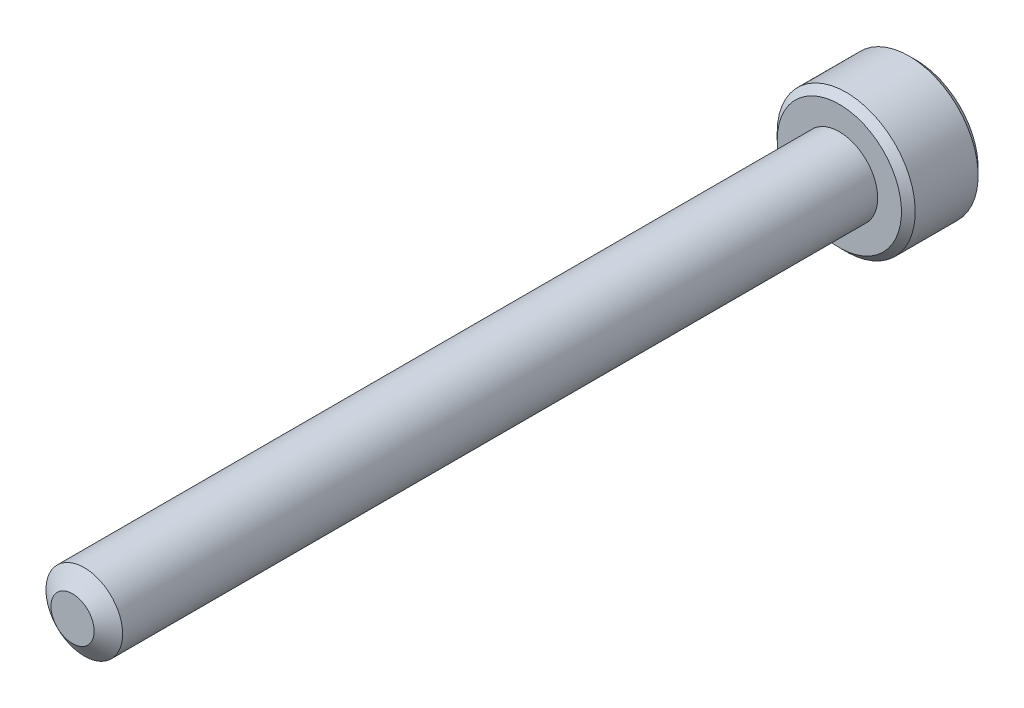
ISO-10303-21;
HEADER;
FILE_DESCRIPTION(('STEP AP214'),'2;1');
FILE_NAME('part.step','',(''),(''),'','','');
FILE_SCHEMA(('AUTOMOTIVE_DESIGN { 1 0 10303 214 1 1 1 1 }'));
ENDSEC;
DATA;
#1=APPLICATION_CONTEXT('core data for automotive mechanical design processes');
#2=APPLICATION_PROTOCOL_DEFINITION('international standard','automotive_design',2000,#1);
#3=PRODUCT_CONTEXT('',#1,'mechanical');
#4=PRODUCT('Part','Part','',(#3));
#5=PRODUCT_RELATED_PRODUCT_CATEGORY('part','',(#4));
#6=PRODUCT_DEFINITION_FORMATION('','',#4);
#7=PRODUCT_DEFINITION_CONTEXT('part definition',#1,'design');
#8=PRODUCT_DEFINITION('design','',#6,#7);
#9=PRODUCT_DEFINITION_SHAPE('','',#8);
#10=(LENGTH_UNIT() NAMED_UNIT(*) SI_UNIT(.MILLI.,.METRE.));
#11=(NAMED_UNIT(*) PLANE_ANGLE_UNIT() SI_UNIT($,.RADIAN.));
#12=(NAMED_UNIT(*) SI_UNIT($,.STERADIAN.) SOLID_ANGLE_UNIT());
#13=UNCERTAINTY_MEASURE_WITH_UNIT(LENGTH_MEASURE(1.E-05),#10,'distance_accuracy_value','');
#14=(GEOMETRIC_REPRESENTATION_CONTEXT(3) GLOBAL_UNCERTAINTY_ASSIGNED_CONTEXT((#13)) GLOBAL_UNIT_ASSIGNED_CONTEXT((#10,
#11,#12)) REPRESENTATION_CONTEXT('',''));
#15=CARTESIAN_POINT('',(0.,0.,0.));
#16=DIRECTION('',(0.,0.,1.));
#17=DIRECTION('',(1.,0.,0.));
#18=AXIS2_PLACEMENT_3D('',#15,#16,#17);
#19=CARTESIAN_POINT('',(0.,0.,-25.));
#20=DIRECTION('',(0.,0.,1.));
#21=DIRECTION('',(1.,0.,0.));
#22=AXIS2_PLACEMENT_3D('',#19,#20,#21);
#23=CYLINDRICAL_SURFACE('',#22,1.25);
#24=CARTESIAN_POINT('',(0.,0.,-25.));
#25=DIRECTION('',(0.,0.,-1.));
#26=DIRECTION('',(-1.,0.,0.));
#27=AXIS2_PLACEMENT_3D('',#24,#25,#26);
#28=CIRCLE('',#27,1.25);
#29=CARTESIAN_POINT('',(-1.25,0.,-25.));
#30=VERTEX_POINT('',#29);
#31=EDGE_CURVE('E213',#30,#30,#28,.F.);
#32=ORIENTED_EDGE('',*,*,#31,.T.);
#33=EDGE_LOOP('',(#32));
#34=FACE_BOUND('',#33,.T.);
#35=CARTESIAN_POINT('',(0.,0.,-0.382511876358969));
#36=DIRECTION('',(0.,0.,1.));
#37=DIRECTION('',(1.,0.,0.));
#38=AXIS2_PLACEMENT_3D('',#35,#36,#37);
#39=CIRCLE('',#38,1.25);
#40=CARTESIAN_POINT('',(1.25,0.,-0.382511876358969));
#41=VERTEX_POINT('',#40);
#42=EDGE_CURVE('E107',#41,#41,#39,.T.);
#43=ORIENTED_EDGE('',*,*,#42,.F.);
#44=EDGE_LOOP('',(#43));
#45=FACE_BOUND('',#44,.T.);
#46=ADVANCED_FACE('F33',(#34,#45),#23,.T.);
#47=CARTESIAN_POINT('',(0.,0.,0.));
#48=DIRECTION('',(0.,0.,-1.));
#49=DIRECTION('',(-1.,0.,0.));
#50=AXIS2_PLACEMENT_3D('',#47,#48,#49);
#51=CONICAL_SURFACE('',#50,0.703716426222746,0.959931088596886);
#52=ORIENTED_EDGE('',*,*,#42,.T.);
#53=EDGE_LOOP('',(#52));
#54=FACE_BOUND('',#53,.T.);
#55=CARTESIAN_POINT('',(0.,0.,0.));
#56=DIRECTION('',(0.,0.,1.));
#57=DIRECTION('',(1.,0.,0.));
#58=AXIS2_PLACEMENT_3D('',#55,#56,#57);
#59=CIRCLE('',#58,0.703716426222746);
#60=CARTESIAN_POINT('',(0.703716426222746,0.,0.));
#61=VERTEX_POINT('',#60);
#62=EDGE_CURVE('E211',#61,#61,#59,.T.);
#63=ORIENTED_EDGE('',*,*,#62,.F.);
#64=EDGE_LOOP('',(#63));
#65=FACE_BOUND('',#64,.T.);
#66=ADVANCED_FACE('F194',(#54,#65),#51,.T.);
#67=CARTESIAN_POINT('',(0.,0.,0.));
#68=DIRECTION('',(0.,0.,1.));
#69=DIRECTION('',(1.,0.,0.));
#70=AXIS2_PLACEMENT_3D('',#67,#68,#69);
#71=PLANE('',#70);
#72=ORIENTED_EDGE('',*,*,#62,.T.);
#73=EDGE_LOOP('',(#72));
#74=FACE_BOUND('',#73,.T.);
#75=ADVANCED_FACE('F191',(#74),#71,.T.);
#76=CARTESIAN_POINT('',(0.,0.,-27.5));
#77=DIRECTION('',(0.,0.,1.));
#78=DIRECTION('',(1.,0.,0.));
#79=AXIS2_PLACEMENT_3D('',#76,#77,#78);
#80=CYLINDRICAL_SURFACE('',#79,2.25);
#81=CARTESIAN_POINT('',(0.,0.,-27.275));
#82=DIRECTION('',(0.,0.,-1.));
#83=DIRECTION('',(-1.,0.,0.));
#84=AXIS2_PLACEMENT_3D('',#81,#82,#83);
#85=CIRCLE('',#84,2.25);
#86=CARTESIAN_POINT('',(-2.25,0.,-27.275));
#87=VERTEX_POINT('',#86);
#88=EDGE_CURVE('E41',#87,#87,#85,.F.);
#89=ORIENTED_EDGE('',*,*,#88,.T.);
#90=EDGE_LOOP('',(#89));
#91=FACE_BOUND('',#90,.T.);
#92=CARTESIAN_POINT('',(0.,0.,-25.225));
#93=DIRECTION('',(0.,0.,-1.));
#94=DIRECTION('',(-1.,0.,0.));
#95=AXIS2_PLACEMENT_3D('',#92,#93,#94);
#96=CIRCLE('',#95,2.25);
#97=CARTESIAN_POINT('',(-2.25,0.,-25.225));
#98=VERTEX_POINT('',#97);
#99=EDGE_CURVE('E170',#98,#98,#96,.T.);
#100=ORIENTED_EDGE('',*,*,#99,.T.);
#101=EDGE_LOOP('',(#100));
#102=FACE_BOUND('',#101,.T.);
#103=ADVANCED_FACE('F175',(#91,#102),#80,.T.);
#104=CARTESIAN_POINT('',(0.,0.,-27.5));
#105=DIRECTION('',(0.,0.,-1.));
#106=DIRECTION('',(-1.,0.,0.));
#107=AXIS2_PLACEMENT_3D('',#104,#105,#106);
#108=PLANE('',#107);
#109=CARTESIAN_POINT('',(0.,0.,-27.5));
#110=DIRECTION('',(0.,0.,-1.));
#111=DIRECTION('',(-1.,0.,0.));
#112=AXIS2_PLACEMENT_3D('',#109,#110,#111);
#113=CIRCLE('',#112,2.025);
#114=CARTESIAN_POINT('',(-2.025,0.,-27.5));
#115=VERTEX_POINT('',#114);
#116=EDGE_CURVE('E106',#115,#115,#113,.T.);
#117=ORIENTED_EDGE('',*,*,#116,.T.);
#118=EDGE_LOOP('',(#117));
#119=FACE_BOUND('',#118,.T.);
#120=CARTESIAN_POINT('',(0.,0.,-27.5));
#121=DIRECTION('',(0.,0.,-1.));
#122=DIRECTION('',(-1.,0.,0.));
#123=AXIS2_PLACEMENT_3D('',#120,#121,#122);
#124=CIRCLE('',#123,1.15470053837925);
#125=CARTESIAN_POINT('',(-0.999999999999994,0.577350269189638,-27.5));
#126=VERTEX_POINT('',#125);
#127=CARTESIAN_POINT('',(0.,1.15470053837925,-27.5));
#128=VERTEX_POINT('',#127);
#129=EDGE_CURVE('E87',#126,#128,#124,.T.);
#130=ORIENTED_EDGE('',*,*,#129,.F.);
#131=CARTESIAN_POINT('',(-0.999999999999994,-0.577350269189627,-27.5));
#132=VERTEX_POINT('',#131);
#133=EDGE_CURVE('E47',#132,#126,#124,.T.);
#134=ORIENTED_EDGE('',*,*,#133,.F.);
#135=CARTESIAN_POINT('',(0.,-1.15470053837925,-27.5));
#136=VERTEX_POINT('',#135);
#137=EDGE_CURVE('E272',#136,#132,#124,.T.);
#138=ORIENTED_EDGE('',*,*,#137,.F.);
#139=CARTESIAN_POINT('',(0.999999999999997,-0.577350269189633,-27.5));
#140=VERTEX_POINT('',#139);
#141=EDGE_CURVE('E54',#140,#136,#124,.T.);
#142=ORIENTED_EDGE('',*,*,#141,.F.);
#143=CARTESIAN_POINT('',(1.,0.577350269189627,-27.5));
#144=VERTEX_POINT('',#143);
#145=EDGE_CURVE('E128',#144,#140,#124,.T.);
#146=ORIENTED_EDGE('',*,*,#145,.F.);
#147=EDGE_CURVE('E96',#128,#144,#124,.T.);
#148=ORIENTED_EDGE('',*,*,#147,.F.);
#149=EDGE_LOOP('',(#130,#134,#138,#142,#146,#148));
#150=FACE_BOUND('',#149,.T.);
#151=ADVANCED_FACE('F127',(#119,#150),#108,.T.);
#152=CARTESIAN_POINT('',(0.,0.,-25.));
#153=DIRECTION('',(0.,0.,-1.));
#154=DIRECTION('',(-1.,0.,0.));
#155=AXIS2_PLACEMENT_3D('',#152,#153,#154);
#156=PLANE('',#155);
#157=CARTESIAN_POINT('',(0.,0.,-25.));
#158=DIRECTION('',(0.,0.,-1.));
#159=DIRECTION('',(-1.,0.,0.));
#160=AXIS2_PLACEMENT_3D('',#157,#158,#159);
#161=CIRCLE('',#160,2.025);
#162=CARTESIAN_POINT('',(-2.025,0.,-25.));
#163=VERTEX_POINT('',#162);
#164=EDGE_CURVE('E11',#163,#163,#161,.F.);
#165=ORIENTED_EDGE('',*,*,#164,.T.);
#166=EDGE_LOOP('',(#165));
#167=FACE_BOUND('',#166,.T.);
#168=ORIENTED_EDGE('',*,*,#31,.F.);
#169=EDGE_LOOP('',(#168));
#170=FACE_BOUND('',#169,.T.);
#171=ADVANCED_FACE('F184',(#167,#170),#156,.F.);
#172=CARTESIAN_POINT('',(0.,0.,-27.5));
#173=DIRECTION('',(0.,0.,-1.));
#174=DIRECTION('',(-1.,0.,0.));
#175=AXIS2_PLACEMENT_3D('',#172,#173,#174);
#176=CONICAL_SURFACE('',#175,1.15470053837925,0.78539816339745);
#177=ORIENTED_EDGE('',*,*,#147,.T.);
#178=CARTESIAN_POINT('',(-0.000200000000001025,1.15481600843309,-27.5001154873726));
#179=CARTESIAN_POINT('',(0.0341825950071793,1.13496520795026,-27.4802779308257));
#180=CARTESIAN_POINT('',(0.0691401181398238,1.11478247255942,-27.4616050206389));
#181=CARTESIAN_POINT('',(0.140422802956089,1.07362739529219,-27.4274147427232));
#182=CARTESIAN_POINT('',(0.176754750528984,1.0526511355808,-27.4119164090235));
#183=CARTESIAN_POINT('',(0.250016613803311,1.01035337909803,-27.3853673071423));
#184=CARTESIAN_POINT('',(0.286927851445414,0.989042666109241,-27.3742497739969));
#185=CARTESIAN_POINT('',(0.361562729310858,0.945952199282692,-27.3571198657762));
#186=CARTESIAN_POINT('',(0.399284088108635,0.924173762626597,-27.3510946974667));
#187=CARTESIAN_POINT('',(0.464292198417933,0.886641312640016,-27.3456605549675));
#188=CARTESIAN_POINT('',(0.491494371528172,0.870936130672276,-27.3448569383167));
#189=CARTESIAN_POINT('',(0.545846040669112,0.839556179862849,-27.3462066994169));
#190=CARTESIAN_POINT('',(0.572995523754875,0.823881418494925,-27.3483607295472));
#191=CARTESIAN_POINT('',(0.65405627732696,0.777080970599368,-27.3591169721285));
#192=CARTESIAN_POINT('',(0.707564140978427,0.746188191116431,-27.3720145564154));
#193=CARTESIAN_POINT('',(0.801476065143431,0.691968116419651,-27.4031407306022));
#194=CARTESIAN_POINT('',(0.842320523671833,0.668386557293373,-27.4197377977018));
#195=CARTESIAN_POINT('',(0.922409637381942,0.622147085933684,-27.4571249246853));
#196=CARTESIAN_POINT('',(0.961659010870436,0.599486449584577,-27.4779013418174));
#197=CARTESIAN_POINT('',(1.0002,0.577234799135791,-27.5001154873726));
#198=B_SPLINE_CURVE_WITH_KNOTS('',3,(#178,#179,#180,#181,#182,#183,#184,#185,#186,#187,#188,
#189,#190,#191,#192,#193,#194,#195,#196,#197),.UNSPECIFIED.,.F.,.F.,(4,2,2,2,2,2,2,2,2,4),(0.,
0.13323767682856,0.26725222983449,0.3991370762693,0.530689603280768,0.624814864263846,
0.718960890149133,0.907306626112098,1.05710100361789,1.20641411519286),.UNSPECIFIED.);
#199=EDGE_CURVE('E101',#128,#144,#198,.T.);
#200=ORIENTED_EDGE('',*,*,#199,.F.);
#201=EDGE_LOOP('',(#177,#200));
#202=FACE_BOUND('',#201,.T.);
#203=ADVANCED_FACE('F102',(#202),#176,.F.);
#204=ORIENTED_EDGE('',*,*,#145,.T.);
#205=CARTESIAN_POINT('',(0.999999999999997,-1.15147208646461,-27.8703856775139));
#206=CARTESIAN_POINT('',(0.999999999999997,-1.12343447988551,-27.8492199198737));
#207=CARTESIAN_POINT('',(0.999999999999997,-1.09524064850697,-27.8282616921759));
#208=CARTESIAN_POINT('',(0.999999999999997,-1.03847715644376,-27.7868460222356));
#209=CARTESIAN_POINT('',(0.999999999999997,-1.00990740382975,-27.7663887061237));
#210=CARTESIAN_POINT('',(0.999999999999997,-0.923120894333473,-27.7056047949545));
#211=CARTESIAN_POINT('',(0.999999999999997,-0.864253173759056,-27.6661922289614));
#212=CARTESIAN_POINT('',(0.999999999999997,-0.740809858258042,-27.5888206642002));
#213=CARTESIAN_POINT('',(0.999999999999997,-0.676100255137804,-27.5510730391143));
#214=CARTESIAN_POINT('',(0.999999999999997,-0.543448939049121,-27.4820245875513));
#215=CARTESIAN_POINT('',(0.999999999999997,-0.475519112027776,-27.4507020278469));
#216=CARTESIAN_POINT('',(0.999999999999997,-0.373555850333527,-27.4123817788838));
#217=CARTESIAN_POINT('',(0.999999999999997,-0.341031989670906,-27.4013835916422));
#218=CARTESIAN_POINT('',(0.999999999999997,-0.275199079052292,-27.3819983421474));
#219=CARTESIAN_POINT('',(0.999999999999997,-0.241889975173931,-27.3736114597767));
#220=CARTESIAN_POINT('',(0.999999999999997,-0.175247517042991,-27.360025220719));
#221=CARTESIAN_POINT('',(0.999999999999997,-0.141925568218174,-27.354770790768));
#222=CARTESIAN_POINT('',(0.999999999999997,-0.0749144362322781,-27.3475486865709));
#223=CARTESIAN_POINT('',(0.999999999999997,-0.041225197850161,-27.3455815136105));
#224=CARTESIAN_POINT('',(0.999999999999997,0.0249580992634217,-27.3450831983932));
#225=CARTESIAN_POINT('',(0.999999999999997,0.0574512826460399,-27.3464302678886));
#226=CARTESIAN_POINT('',(0.999999999999997,0.122148505701867,-27.352216484499));
#227=CARTESIAN_POINT('',(0.999999999999997,0.154352610132927,-27.3566549206615));
#228=CARTESIAN_POINT('',(0.999999999999997,0.21879989886764,-27.3684568301452));
#229=CARTESIAN_POINT('',(0.999999999999997,0.251033743268954,-27.3758705410385));
#230=CARTESIAN_POINT('',(0.999999999999997,0.314797132354919,-27.3932289424987));
#231=CARTESIAN_POINT('',(0.999999999999997,0.346326735731005,-27.4031734212888));
#232=CARTESIAN_POINT('',(0.999999999999997,0.445594187730206,-27.4382234825543));
#233=CARTESIAN_POINT('',(0.999999999999997,0.511919139476037,-27.4673208583567));
#234=CARTESIAN_POINT('',(0.999999999999997,0.641453244657533,-27.5320153296865));
#235=CARTESIAN_POINT('',(0.999999999999997,0.704650133126345,-27.5676357767152));
#236=CARTESIAN_POINT('',(0.999999999999997,0.825428490174988,-27.6411239013469));
#237=CARTESIAN_POINT('',(0.999999999999997,0.883132947867686,-27.6787919471355));
#238=CARTESIAN_POINT('',(0.999999999999997,0.968148853704567,-27.7370228529432));
#239=CARTESIAN_POINT('',(0.999999999999997,0.996120570380286,-27.7566384757629));
#240=CARTESIAN_POINT('',(0.999999999999997,1.05168177729902,-27.7963885170613));
#241=CARTESIAN_POINT('',(0.999999999999997,1.079271369977,-27.8165227921988));
#242=CARTESIAN_POINT('',(0.999999999999997,1.10670185346329,-27.836872119073));
#243=B_SPLINE_CURVE_WITH_KNOTS('',3,(#205,#206,#207,#208,#209,#210,#211,#212,#213,#214,#215,
#216,#217,#218,#219,#220,#221,#222,#223,#224,#225,#226,#227,#228,#229,#230,#231,#232,#233,#234,
#235,#236,#237,#238,#239,#240,#241,#242),.UNSPECIFIED.,.F.,.F.,(4,2,2,2,2,2,2,2,2,2,2,2,2,2,2,2,
2,2,4),(0.,0.10538645908329,0.210799187330124,0.423233611565468,0.6477935409085,
0.871580877738606,0.974493074181417,1.07741235827201,1.17846428203204,1.27953161415762,
1.3769408673961,1.47432772585407,1.57343322804293,1.67253043972851,1.88917353996827,
2.10660791038812,2.31323734249843,2.41572589232044,2.51818641476503),.UNSPECIFIED.);
#244=EDGE_CURVE('E95',#144,#140,#243,.F.);
#245=ORIENTED_EDGE('',*,*,#244,.F.);
#246=EDGE_LOOP('',(#204,#245));
#247=FACE_BOUND('',#246,.T.);
#248=ADVANCED_FACE('F278',(#247),#176,.F.);
#249=ORIENTED_EDGE('',*,*,#141,.T.);
#250=CARTESIAN_POINT('',(1.0002,-0.577234799135786,-27.5001154873726));
#251=CARTESIAN_POINT('',(0.965817404992817,-0.597085599618619,-27.4802779308257));
#252=CARTESIAN_POINT('',(0.930859881860173,-0.617268335009454,-27.4616050206389));
#253=CARTESIAN_POINT('',(0.859577197043908,-0.658423412276684,-27.4274147427232));
#254=CARTESIAN_POINT('',(0.823245249471014,-0.679399671988078,-27.4119164090235));
#255=CARTESIAN_POINT('',(0.749983386196687,-0.721697428470844,-27.3853673071423));
#256=CARTESIAN_POINT('',(0.713072148554584,-0.743008141459634,-27.3742497739969));
#257=CARTESIAN_POINT('',(0.63843727068914,-0.786098608286184,-27.3571198657762));
#258=CARTESIAN_POINT('',(0.600715911891363,-0.807877044942279,-27.3510946974667));
#259=CARTESIAN_POINT('',(0.535707801582065,-0.84540949492886,-27.3456605549675));
#260=CARTESIAN_POINT('',(0.508505628471827,-0.861114676896599,-27.3448569383167));
#261=CARTESIAN_POINT('',(0.454153959330887,-0.892494627706026,-27.3462066994169));
#262=CARTESIAN_POINT('',(0.427004476245123,-0.908169389073951,-27.3483607295472));
#263=CARTESIAN_POINT('',(0.345943722673039,-0.954969836969508,-27.3591169721285));
#264=CARTESIAN_POINT('',(0.292435859021572,-0.985862616452445,-27.3720145564154));
#265=CARTESIAN_POINT('',(0.198523934856568,-1.04008269114923,-27.4031407306022));
#266=CARTESIAN_POINT('',(0.157679476328165,-1.0636642502755,-27.4197377977018));
#267=CARTESIAN_POINT('',(0.0775903626180561,-1.10990372163519,-27.4571249246853));
#268=CARTESIAN_POINT('',(0.0383409891295621,-1.1325643579843,-27.4779013418174));
#269=CARTESIAN_POINT('',(-0.000199999999999498,-1.15481600843309,-27.5001154873726));
#270=B_SPLINE_CURVE_WITH_KNOTS('',3,(#250,#251,#252,#253,#254,#255,#256,#257,#258,#259,#260,
#261,#262,#263,#264,#265,#266,#267,#268,#269),.UNSPECIFIED.,.F.,.F.,(4,2,2,2,2,2,2,2,2,4),(0.,
0.133237676828559,0.267252229834489,0.399137076269298,0.530689603280767,0.624814864263844,
0.718960890149131,0.907306626112095,1.05710100361789,1.20641411519286),.UNSPECIFIED.);
#271=EDGE_CURVE('E138',#140,#136,#270,.T.);
#272=ORIENTED_EDGE('',*,*,#271,.F.);
#273=EDGE_LOOP('',(#249,#272));
#274=FACE_BOUND('',#273,.T.);
#275=ADVANCED_FACE('F275',(#274),#176,.F.);
#276=ORIENTED_EDGE('',*,*,#137,.T.);
#277=CARTESIAN_POINT('',(0.000199999999999672,-1.15481600843309,-27.5001154873726));
#278=CARTESIAN_POINT('',(-0.0341825950071809,-1.13496520795025,-27.4802779308257));
#279=CARTESIAN_POINT('',(-0.0691401181398248,-1.11478247255942,-27.4616050206389));
#280=CARTESIAN_POINT('',(-0.140422802956089,-1.07362739529219,-27.4274147427232));
#281=CARTESIAN_POINT('',(-0.176754750528984,-1.0526511355808,-27.4119164090235));
#282=CARTESIAN_POINT('',(-0.250016613803311,-1.01035337909803,-27.3853673071423));
#283=CARTESIAN_POINT('',(-0.286927851445414,-0.989042666109239,-27.3742497739969));
#284=CARTESIAN_POINT('',(-0.361562729310859,-0.945952199282689,-27.3571198657762));
#285=CARTESIAN_POINT('',(-0.399284088108635,-0.924173762626594,-27.3510946974667));
#286=CARTESIAN_POINT('',(-0.464292198417933,-0.886641312640013,-27.3456605549675));
#287=CARTESIAN_POINT('',(-0.491494371528171,-0.870936130672273,-27.3448569383167));
#288=CARTESIAN_POINT('',(-0.545846040669111,-0.839556179862846,-27.3462066994169));
#289=CARTESIAN_POINT('',(-0.572995523754875,-0.823881418494922,-27.3483607295472));
#290=CARTESIAN_POINT('',(-0.654056277326959,-0.777080970599365,-27.3591169721285));
#291=CARTESIAN_POINT('',(-0.707564140978426,-0.746188191116429,-27.3720145564154));
#292=CARTESIAN_POINT('',(-0.80147606514343,-0.691968116419648,-27.4031407306022));
#293=CARTESIAN_POINT('',(-0.842320523671832,-0.668386557293371,-27.4197377977018));
#294=CARTESIAN_POINT('',(-0.92240963738194,-0.622147085933681,-27.4571249246853));
#295=CARTESIAN_POINT('',(-0.961659010870434,-0.599486449584575,-27.4779013418174));
#296=CARTESIAN_POINT('',(-1.0002,-0.577234799135788,-27.5001154873726));
#297=B_SPLINE_CURVE_WITH_KNOTS('',3,(#277,#278,#279,#280,#281,#282,#283,#284,#285,#286,#287,
#288,#289,#290,#291,#292,#293,#294,#295,#296),.UNSPECIFIED.,.F.,.F.,(4,2,2,2,2,2,2,2,2,4),(0.,
0.133237676828557,0.267252229834489,0.399137076269298,0.530689603280766,0.624814864263844,
0.718960890149131,0.907306626112095,1.05710100361789,1.20641411519285),.UNSPECIFIED.);
#298=EDGE_CURVE('E249',#136,#132,#297,.T.);
#299=ORIENTED_EDGE('',*,*,#298,.F.);
#300=EDGE_LOOP('',(#276,#299));
#301=FACE_BOUND('',#300,.T.);
#302=ADVANCED_FACE('F274',(#301),#176,.F.);
#303=ORIENTED_EDGE('',*,*,#133,.T.);
#304=CARTESIAN_POINT('',(-0.999999999999994,-1.15147208646462,-27.8703856775139));
#305=CARTESIAN_POINT('',(-0.999999999999994,-1.12343447988552,-27.8492199198737));
#306=CARTESIAN_POINT('',(-0.999999999999994,-1.09524064850697,-27.8282616921759));
#307=CARTESIAN_POINT('',(-0.999999999999994,-1.03847715644376,-27.7868460222356));
#308=CARTESIAN_POINT('',(-0.999999999999994,-1.00990740382975,-27.7663887061237));
#309=CARTESIAN_POINT('',(-0.999999999999994,-0.92312089433348,-27.7056047949545));
#310=CARTESIAN_POINT('',(-0.999999999999994,-0.864253173759062,-27.6661922289614));
#311=CARTESIAN_POINT('',(-0.999999999999994,-0.740809858258047,-27.5888206642002));
#312=CARTESIAN_POINT('',(-0.999999999999994,-0.676100255137809,-27.5510730391143));
#313=CARTESIAN_POINT('',(-0.999999999999994,-0.543448939049126,-27.4820245875513));
#314=CARTESIAN_POINT('',(-0.999999999999994,-0.47551911202778,-27.4507020278469));
#315=CARTESIAN_POINT('',(-0.999999999999994,-0.37355585033353,-27.4123817788838));
#316=CARTESIAN_POINT('',(-0.999999999999994,-0.341031989670909,-27.4013835916422));
#317=CARTESIAN_POINT('',(-0.999999999999994,-0.275199079052295,-27.3819983421474));
#318=CARTESIAN_POINT('',(-0.999999999999994,-0.241889975173935,-27.3736114597767));
#319=CARTESIAN_POINT('',(-0.999999999999994,-0.175247517042995,-27.360025220719));
#320=CARTESIAN_POINT('',(-0.999999999999994,-0.141925568218177,-27.354770790768));
#321=CARTESIAN_POINT('',(-0.999999999999994,-0.0749144362322815,-27.3475486865709));
#322=CARTESIAN_POINT('',(-0.999999999999994,-0.0412251978501645,-27.3455815136105));
#323=CARTESIAN_POINT('',(-0.999999999999994,0.024958099263418,-27.3450831983932));
#324=CARTESIAN_POINT('',(-0.999999999999994,0.0574512826460363,-27.3464302678886));
#325=CARTESIAN_POINT('',(-0.999999999999994,0.122148505701864,-27.352216484499));
#326=CARTESIAN_POINT('',(-0.999999999999994,0.154352610132923,-27.3566549206615));
#327=CARTESIAN_POINT('',(-0.999999999999994,0.218799898867636,-27.3684568301452));
#328=CARTESIAN_POINT('',(-0.999999999999994,0.251033743268949,-27.3758705410385));
#329=CARTESIAN_POINT('',(-0.999999999999994,0.314797132354914,-27.3932289424987));
#330=CARTESIAN_POINT('',(-0.999999999999994,0.346326735731,-27.4031734212888));
#331=CARTESIAN_POINT('',(-0.999999999999994,0.445594187730201,-27.4382234825543));
#332=CARTESIAN_POINT('',(-0.999999999999994,0.511919139476032,-27.4673208583567));
#333=CARTESIAN_POINT('',(-0.999999999999994,0.641453244657527,-27.5320153296865));
#334=CARTESIAN_POINT('',(-0.999999999999994,0.704650133126339,-27.5676357767152));
#335=CARTESIAN_POINT('',(-0.999999999999994,0.825428490174979,-27.6411239013469));
#336=CARTESIAN_POINT('',(-0.999999999999994,0.883132947867676,-27.6787919471355));
#337=CARTESIAN_POINT('',(-0.999999999999994,0.968148853704555,-27.7370228529431));
#338=CARTESIAN_POINT('',(-0.999999999999994,0.996120570380274,-27.7566384757628));
#339=CARTESIAN_POINT('',(-0.999999999999994,1.051681777299,-27.7963885170613));
#340=CARTESIAN_POINT('',(-0.999999999999994,1.07927136997699,-27.8165227921988));
#341=CARTESIAN_POINT('',(-0.999999999999994,1.10670185346328,-27.836872119073));
#342=B_SPLINE_CURVE_WITH_KNOTS('',3,(#304,#305,#306,#307,#308,#309,#310,#311,#312,#313,#314,
#315,#316,#317,#318,#319,#320,#321,#322,#323,#324,#325,#326,#327,#328,#329,#330,#331,#332,#333,
#334,#335,#336,#337,#338,#339,#340,#341),.UNSPECIFIED.,.F.,.F.,(4,2,2,2,2,2,2,2,2,2,2,2,2,2,2,2,
2,2,4),(0.,0.10538645908329,0.210799187330124,0.423233611565468,0.647793540908506,
0.871580877738613,0.974493074181422,1.07741235827201,1.17846428203205,1.27953161415762,
1.3769408673961,1.47432772585408,1.57343322804293,1.67253043972851,1.88917353996827,
2.10660791038813,2.31323734249843,2.41572589232044,2.51818641476502),.UNSPECIFIED.);
#343=EDGE_CURVE('E117',#132,#126,#342,.T.);
#344=ORIENTED_EDGE('',*,*,#343,.F.);
#345=EDGE_LOOP('',(#303,#344));
#346=FACE_BOUND('',#345,.T.);
#347=ADVANCED_FACE('F287',(#346),#176,.F.);
#348=ORIENTED_EDGE('',*,*,#129,.T.);
#349=CARTESIAN_POINT('',(-1.00019999999999,0.577234799135794,-27.5001154873726));
#350=CARTESIAN_POINT('',(-0.965817404992813,0.597085599618627,-27.4802779308257));
#351=CARTESIAN_POINT('',(-0.93085988186017,0.617268335009461,-27.4616050206389));
#352=CARTESIAN_POINT('',(-0.859577197043907,0.65842341227669,-27.4274147427232));
#353=CARTESIAN_POINT('',(-0.823245249471013,0.679399671988084,-27.4119164090235));
#354=CARTESIAN_POINT('',(-0.749983386196686,0.72169742847085,-27.3853673071423));
#355=CARTESIAN_POINT('',(-0.713072148554584,0.74300814145964,-27.3742497739969));
#356=CARTESIAN_POINT('',(-0.63843727068914,0.786098608286188,-27.3571198657762));
#357=CARTESIAN_POINT('',(-0.600715911891365,0.807877044942283,-27.3510946974667));
#358=CARTESIAN_POINT('',(-0.535707801582068,0.845409494928864,-27.3456605549675));
#359=CARTESIAN_POINT('',(-0.508505628471829,0.861114676896603,-27.3448569383167));
#360=CARTESIAN_POINT('',(-0.454153959330889,0.89249462770603,-27.3462066994169));
#361=CARTESIAN_POINT('',(-0.427004476245125,0.908169389073955,-27.3483607295472));
#362=CARTESIAN_POINT('',(-0.345943722673041,0.954969836969512,-27.3591169721285));
#363=CARTESIAN_POINT('',(-0.292435859021574,0.985862616452448,-27.3720145564154));
#364=CARTESIAN_POINT('',(-0.19852393485657,1.04008269114923,-27.4031407306022));
#365=CARTESIAN_POINT('',(-0.157679476328168,1.06366425027551,-27.4197377977018));
#366=CARTESIAN_POINT('',(-0.0775903626180584,1.1099037216352,-27.4571249246853));
#367=CARTESIAN_POINT('',(-0.038340989129564,1.1325643579843,-27.4779013418174));
#368=CARTESIAN_POINT('',(0.000199999999998042,1.15481600843309,-27.5001154873726));
#369=B_SPLINE_CURVE_WITH_KNOTS('',3,(#349,#350,#351,#352,#353,#354,#355,#356,#357,#358,#359,
#360,#361,#362,#363,#364,#365,#366,#367,#368),.UNSPECIFIED.,.F.,.F.,(4,2,2,2,2,2,2,2,2,4),(0.,
0.133237676828556,0.267252229834486,0.399137076269293,0.530689603280758,0.624814864263836,
0.718960890149123,0.907306626112087,1.05710100361788,1.20641411519285),.UNSPECIFIED.);
#370=EDGE_CURVE('E91',#126,#128,#369,.T.);
#371=ORIENTED_EDGE('',*,*,#370,.F.);
#372=EDGE_LOOP('',(#348,#371));
#373=FACE_BOUND('',#372,.T.);
#374=ADVANCED_FACE('F89',(#373),#176,.F.);
#375=CARTESIAN_POINT('',(0.999999999999997,1.73205080756888,-26.));
#376=DIRECTION('',(0.,0.,-1.));
#377=DIRECTION('',(-1.,0.,0.));
#378=AXIS2_PLACEMENT_3D('',#375,#376,#377);
#379=PLANE('',#378);
#380=DIRECTION('',(0.866025403784439,0.5,0.));
#381=VECTOR('',#380,1.);
#382=CARTESIAN_POINT('',(-0.999999999999994,0.577350269189631,-26.));
#383=LINE('',#382,#381);
#384=CARTESIAN_POINT('',(-0.999999999999994,0.577350269189631,-26.));
#385=VERTEX_POINT('',#384);
#386=CARTESIAN_POINT('',(0.,1.15470053837925,-26.));
#387=VERTEX_POINT('',#386);
#388=EDGE_CURVE('E116',#385,#387,#383,.T.);
#389=ORIENTED_EDGE('',*,*,#388,.T.);
#390=DIRECTION('',(0.866025403784439,-0.499999999999999,0.));
#391=VECTOR('',#390,1.);
#392=CARTESIAN_POINT('',(0.,1.15470053837925,-26.));
#393=LINE('',#392,#391);
#394=CARTESIAN_POINT('',(0.999999999999997,0.577350269189629,-26.));
#395=VERTEX_POINT('',#394);
#396=EDGE_CURVE('E121',#387,#395,#393,.T.);
#397=ORIENTED_EDGE('',*,*,#396,.T.);
#398=DIRECTION('',(0.,-1.,0.));
#399=VECTOR('',#398,1.);
#400=CARTESIAN_POINT('',(0.999999999999997,0.577350269189629,-26.));
#401=LINE('',#400,#399);
#402=CARTESIAN_POINT('',(0.999999999999997,-0.577350269189624,-26.));
#403=VERTEX_POINT('',#402);
#404=EDGE_CURVE('E235',#395,#403,#401,.T.);
#405=ORIENTED_EDGE('',*,*,#404,.T.);
#406=DIRECTION('',(-0.866025403784438,-0.500000000000001,0.));
#407=VECTOR('',#406,1.);
#408=CARTESIAN_POINT('',(0.999999999999997,-0.577350269189624,-26.));
#409=LINE('',#408,#407);
#410=CARTESIAN_POINT('',(0.,-1.15470053837925,-26.));
#411=VERTEX_POINT('',#410);
#412=EDGE_CURVE('E232',#403,#411,#409,.T.);
#413=ORIENTED_EDGE('',*,*,#412,.T.);
#414=DIRECTION('',(-0.866025403784439,0.5,0.));
#415=VECTOR('',#414,1.);
#416=CARTESIAN_POINT('',(0.,-1.15470053837925,-26.));
#417=LINE('',#416,#415);
#418=CARTESIAN_POINT('',(-0.999999999999994,-0.577350269189627,-26.));
#419=VERTEX_POINT('',#418);
#420=EDGE_CURVE('E229',#411,#419,#417,.T.);
#421=ORIENTED_EDGE('',*,*,#420,.T.);
#422=DIRECTION('',(0.,1.,0.));
#423=VECTOR('',#422,1.);
#424=CARTESIAN_POINT('',(-0.999999999999994,-0.577350269189627,-26.));
#425=LINE('',#424,#423);
#426=EDGE_CURVE('E124',#419,#385,#425,.T.);
#427=ORIENTED_EDGE('',*,*,#426,.T.);
#428=EDGE_LOOP('',(#389,#397,#405,#413,#421,#427));
#429=FACE_BOUND('',#428,.T.);
#430=ADVANCED_FACE('F158',(#429),#379,.T.);
#431=CARTESIAN_POINT('',(0.,1.15470053837925,-26.));
#432=DIRECTION('',(0.499999999999999,0.866025403784439,0.));
#433=DIRECTION('',(-0.866025403784439,0.499999999999999,0.));
#434=AXIS2_PLACEMENT_3D('',#431,#432,#433);
#435=PLANE('',#434);
#436=DIRECTION('',(0.,0.,-1.));
#437=VECTOR('',#436,1.);
#438=CARTESIAN_POINT('',(0.,1.15470053837925,-26.));
#439=LINE('',#438,#437);
#440=EDGE_CURVE('E113',#387,#128,#439,.T.);
#441=ORIENTED_EDGE('',*,*,#440,.T.);
#442=ORIENTED_EDGE('',*,*,#199,.T.);
#443=DIRECTION('',(0.,0.,-1.));
#444=VECTOR('',#443,1.);
#445=CARTESIAN_POINT('',(0.999999999999997,0.577350269189629,-26.));
#446=LINE('',#445,#444);
#447=EDGE_CURVE('E123',#395,#144,#446,.T.);
#448=ORIENTED_EDGE('',*,*,#447,.F.);
#449=ORIENTED_EDGE('',*,*,#396,.F.);
#450=EDGE_LOOP('',(#441,#442,#448,#449));
#451=FACE_BOUND('',#450,.T.);
#452=ADVANCED_FACE('F119',(#451),#435,.F.);
#453=CARTESIAN_POINT('',(0.999999999999997,0.577350269189629,-26.));
#454=DIRECTION('',(1.,0.,0.));
#455=DIRECTION('',(0.,0.,-1.));
#456=AXIS2_PLACEMENT_3D('',#453,#454,#455);
#457=PLANE('',#456);
#458=ORIENTED_EDGE('',*,*,#447,.T.);
#459=ORIENTED_EDGE('',*,*,#244,.T.);
#460=DIRECTION('',(0.,0.,-1.));
#461=VECTOR('',#460,1.);
#462=CARTESIAN_POINT('',(0.999999999999997,-0.577350269189624,-26.));
#463=LINE('',#462,#461);
#464=EDGE_CURVE('E218',#403,#140,#463,.T.);
#465=ORIENTED_EDGE('',*,*,#464,.F.);
#466=ORIENTED_EDGE('',*,*,#404,.F.);
#467=EDGE_LOOP('',(#458,#459,#465,#466));
#468=FACE_BOUND('',#467,.T.);
#469=ADVANCED_FACE('F147',(#468),#457,.F.);
#470=CARTESIAN_POINT('',(0.999999999999997,-0.577350269189624,-26.));
#471=DIRECTION('',(0.500000000000001,-0.866025403784438,0.));
#472=DIRECTION('',(0.866025403784438,0.500000000000001,0.));
#473=AXIS2_PLACEMENT_3D('',#470,#471,#472);
#474=PLANE('',#473);
#475=ORIENTED_EDGE('',*,*,#464,.T.);
#476=ORIENTED_EDGE('',*,*,#271,.T.);
#477=DIRECTION('',(0.,0.,-1.));
#478=VECTOR('',#477,1.);
#479=CARTESIAN_POINT('',(0.,-1.15470053837925,-26.));
#480=LINE('',#479,#478);
#481=EDGE_CURVE('E221',#411,#136,#480,.T.);
#482=ORIENTED_EDGE('',*,*,#481,.F.);
#483=ORIENTED_EDGE('',*,*,#412,.F.);
#484=EDGE_LOOP('',(#475,#476,#482,#483));
#485=FACE_BOUND('',#484,.T.);
#486=ADVANCED_FACE('F151',(#485),#474,.F.);
#487=CARTESIAN_POINT('',(0.,-1.15470053837925,-26.));
#488=DIRECTION('',(-0.5,-0.866025403784439,0.));
#489=DIRECTION('',(0.866025403784439,-0.5,0.));
#490=AXIS2_PLACEMENT_3D('',#487,#488,#489);
#491=PLANE('',#490);
#492=ORIENTED_EDGE('',*,*,#481,.T.);
#493=ORIENTED_EDGE('',*,*,#298,.T.);
#494=DIRECTION('',(0.,0.,-1.));
#495=VECTOR('',#494,1.);
#496=CARTESIAN_POINT('',(-0.999999999999994,-0.577350269189627,-26.));
#497=LINE('',#496,#495);
#498=EDGE_CURVE('E224',#419,#132,#497,.T.);
#499=ORIENTED_EDGE('',*,*,#498,.F.);
#500=ORIENTED_EDGE('',*,*,#420,.F.);
#501=EDGE_LOOP('',(#492,#493,#499,#500));
#502=FACE_BOUND('',#501,.T.);
#503=ADVANCED_FACE('F257',(#502),#491,.F.);
#504=CARTESIAN_POINT('',(-0.999999999999994,-0.577350269189627,-26.));
#505=DIRECTION('',(-1.,0.,0.));
#506=DIRECTION('',(0.,0.,1.));
#507=AXIS2_PLACEMENT_3D('',#504,#505,#506);
#508=PLANE('',#507);
#509=ORIENTED_EDGE('',*,*,#498,.T.);
#510=ORIENTED_EDGE('',*,*,#343,.T.);
#511=DIRECTION('',(0.,0.,-1.));
#512=VECTOR('',#511,1.);
#513=CARTESIAN_POINT('',(-0.999999999999994,0.577350269189631,-26.));
#514=LINE('',#513,#512);
#515=EDGE_CURVE('E115',#385,#126,#514,.T.);
#516=ORIENTED_EDGE('',*,*,#515,.F.);
#517=ORIENTED_EDGE('',*,*,#426,.F.);
#518=EDGE_LOOP('',(#509,#510,#516,#517));
#519=FACE_BOUND('',#518,.T.);
#520=ADVANCED_FACE('F254',(#519),#508,.F.);
#521=CARTESIAN_POINT('',(-0.999999999999994,0.577350269189631,-26.));
#522=DIRECTION('',(-0.5,0.866025403784439,0.));
#523=DIRECTION('',(-0.866025403784439,-0.5,0.));
#524=AXIS2_PLACEMENT_3D('',#521,#522,#523);
#525=PLANE('',#524);
#526=ORIENTED_EDGE('',*,*,#515,.T.);
#527=ORIENTED_EDGE('',*,*,#370,.T.);
#528=ORIENTED_EDGE('',*,*,#440,.F.);
#529=ORIENTED_EDGE('',*,*,#388,.F.);
#530=EDGE_LOOP('',(#526,#527,#528,#529));
#531=FACE_BOUND('',#530,.T.);
#532=ADVANCED_FACE('F111',(#531),#525,.F.);
#533=CARTESIAN_POINT('',(0.,0.,-27.5));
#534=DIRECTION('',(0.,0.,1.));
#535=DIRECTION('',(1.,0.,0.));
#536=AXIS2_PLACEMENT_3D('',#533,#534,#535);
#537=CONICAL_SURFACE('',#536,2.025,0.785398163397444);
#538=ORIENTED_EDGE('',*,*,#88,.F.);
#539=EDGE_LOOP('',(#538));
#540=FACE_BOUND('',#539,.T.);
#541=ORIENTED_EDGE('',*,*,#116,.F.);
#542=EDGE_LOOP('',(#541));
#543=FACE_BOUND('',#542,.T.);
#544=ADVANCED_FACE('F178',(#540,#543),#537,.T.);
#545=CARTESIAN_POINT('',(0.,0.,-25.225));
#546=DIRECTION('',(0.,0.,-1.));
#547=DIRECTION('',(-1.,0.,0.));
#548=AXIS2_PLACEMENT_3D('',#545,#546,#547);
#549=CONICAL_SURFACE('',#548,2.25,0.785398163397444);
#550=ORIENTED_EDGE('',*,*,#164,.F.);
#551=EDGE_LOOP('',(#550));
#552=FACE_BOUND('',#551,.T.);
#553=ORIENTED_EDGE('',*,*,#99,.F.);
#554=EDGE_LOOP('',(#553));
#555=FACE_BOUND('',#554,.T.);
#556=ADVANCED_FACE('F35',(#552,#555),#549,.T.);
#557=CLOSED_SHELL('',(#46,#66,#75,#103,#151,#171,#203,#248,#275,#302,#347,#374,#430,#452,#469,
#486,#503,#520,#532,#544,#556));
#558=MANIFOLD_SOLID_BREP('B2',#557);
#559=ADVANCED_BREP_SHAPE_REPRESENTATION('',(#18,#558),#14);
#560=SHAPE_DEFINITION_REPRESENTATION(#9,#559);
ENDSEC;
END-ISO-10303-21;
